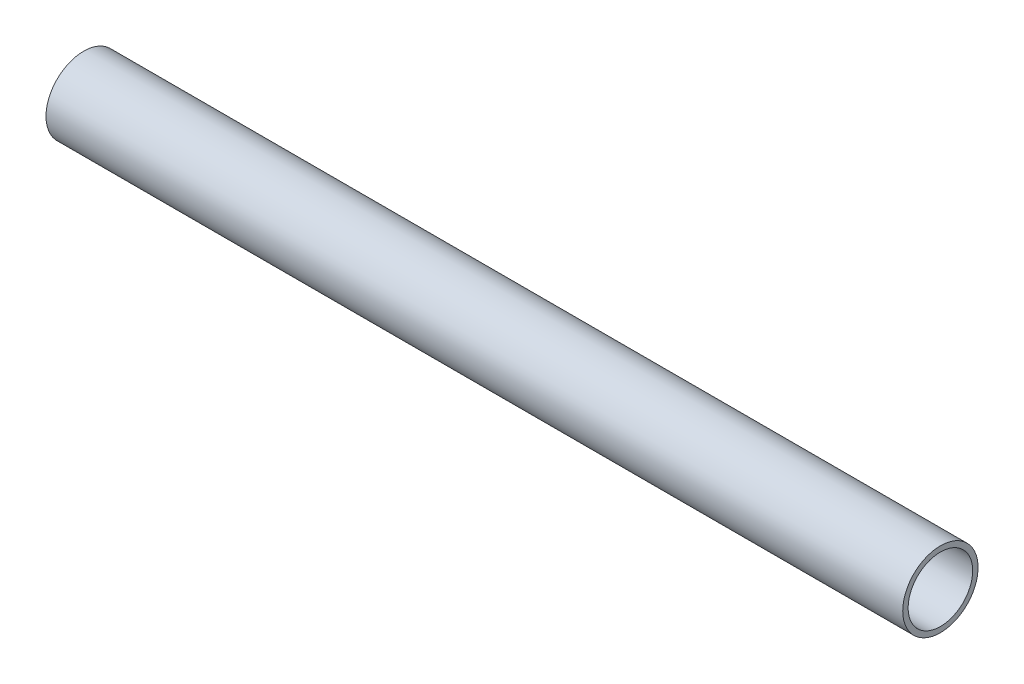
ISO-10303-21;
HEADER;
FILE_DESCRIPTION(('STEP AP214'),'2;1');
FILE_NAME('part.step','',(''),(''),'','','');
FILE_SCHEMA(('AUTOMOTIVE_DESIGN { 1 0 10303 214 1 1 1 1 }'));
ENDSEC;
DATA;
#1=APPLICATION_CONTEXT('core data for automotive mechanical design processes');
#2=APPLICATION_PROTOCOL_DEFINITION('international standard','automotive_design',2000,#1);
#3=PRODUCT_CONTEXT('',#1,'mechanical');
#4=PRODUCT('Part','Part','',(#3));
#5=PRODUCT_RELATED_PRODUCT_CATEGORY('part','',(#4));
#6=PRODUCT_DEFINITION_FORMATION('','',#4);
#7=PRODUCT_DEFINITION_CONTEXT('part definition',#1,'design');
#8=PRODUCT_DEFINITION('design','',#6,#7);
#9=PRODUCT_DEFINITION_SHAPE('','',#8);
#10=(LENGTH_UNIT() NAMED_UNIT(*) SI_UNIT(.MILLI.,.METRE.));
#11=(NAMED_UNIT(*) PLANE_ANGLE_UNIT() SI_UNIT($,.RADIAN.));
#12=(NAMED_UNIT(*) SI_UNIT($,.STERADIAN.) SOLID_ANGLE_UNIT());
#13=UNCERTAINTY_MEASURE_WITH_UNIT(LENGTH_MEASURE(1.E-05),#10,'distance_accuracy_value','');
#14=(GEOMETRIC_REPRESENTATION_CONTEXT(3) GLOBAL_UNCERTAINTY_ASSIGNED_CONTEXT((#13)) GLOBAL_UNIT_ASSIGNED_CONTEXT((#10,
#11,#12)) REPRESENTATION_CONTEXT('',''));
#15=CARTESIAN_POINT('',(0.,0.,0.));
#16=DIRECTION('',(0.,0.,1.));
#17=DIRECTION('',(1.,0.,0.));
#18=AXIS2_PLACEMENT_3D('',#15,#16,#17);
#19=CARTESIAN_POINT('',(79.6,0.,0.));
#20=DIRECTION('',(1.,0.,0.));
#21=DIRECTION('',(0.,0.,-1.));
#22=AXIS2_PLACEMENT_3D('',#19,#20,#21);
#23=PLANE('',#22);
#24=CARTESIAN_POINT('',(79.6,0.,0.));
#25=DIRECTION('',(1.,0.,0.));
#26=DIRECTION('',(0.,0.,-1.));
#27=AXIS2_PLACEMENT_3D('',#24,#25,#26);
#28=CIRCLE('',#27,7.);
#29=CARTESIAN_POINT('',(79.6,0.,7.));
#30=VERTEX_POINT('',#29);
#31=EDGE_CURVE('E10',#30,#30,#28,.T.);
#32=ORIENTED_EDGE('',*,*,#31,.T.);
#33=EDGE_LOOP('',(#32));
#34=FACE_BOUND('',#33,.T.);
#35=CARTESIAN_POINT('',(79.6,0.,0.));
#36=DIRECTION('',(1.,0.,0.));
#37=DIRECTION('',(0.,0.,-1.));
#38=AXIS2_PLACEMENT_3D('',#35,#36,#37);
#39=CIRCLE('',#38,6.);
#40=CARTESIAN_POINT('',(79.6,0.,6.));
#41=VERTEX_POINT('',#40);
#42=EDGE_CURVE('E54',#41,#41,#39,.T.);
#43=ORIENTED_EDGE('',*,*,#42,.F.);
#44=EDGE_LOOP('',(#43));
#45=FACE_BOUND('',#44,.T.);
#46=ADVANCED_FACE('F41',(#34,#45),#23,.T.);
#47=CARTESIAN_POINT('',(-79.6,0.,0.));
#48=DIRECTION('',(1.,0.,0.));
#49=DIRECTION('',(0.,0.,-1.));
#50=AXIS2_PLACEMENT_3D('',#47,#48,#49);
#51=PLANE('',#50);
#52=CARTESIAN_POINT('',(-79.6,0.,0.));
#53=DIRECTION('',(1.,0.,0.));
#54=DIRECTION('',(0.,0.,-1.));
#55=AXIS2_PLACEMENT_3D('',#52,#53,#54);
#56=CIRCLE('',#55,7.);
#57=CARTESIAN_POINT('',(-79.6,0.,7.));
#58=VERTEX_POINT('',#57);
#59=EDGE_CURVE('E45',#58,#58,#56,.T.);
#60=ORIENTED_EDGE('',*,*,#59,.F.);
#61=EDGE_LOOP('',(#60));
#62=FACE_BOUND('',#61,.T.);
#63=CARTESIAN_POINT('',(-79.6,0.,0.));
#64=DIRECTION('',(1.,0.,0.));
#65=DIRECTION('',(0.,0.,-1.));
#66=AXIS2_PLACEMENT_3D('',#63,#64,#65);
#67=CIRCLE('',#66,6.);
#68=CARTESIAN_POINT('',(-79.6,0.,6.));
#69=VERTEX_POINT('',#68);
#70=EDGE_CURVE('E56',#69,#69,#67,.T.);
#71=ORIENTED_EDGE('',*,*,#70,.T.);
#72=EDGE_LOOP('',(#71));
#73=FACE_BOUND('',#72,.T.);
#74=ADVANCED_FACE('F68',(#62,#73),#51,.F.);
#75=CARTESIAN_POINT('',(79.6,0.,0.));
#76=DIRECTION('',(-1.,0.,0.));
#77=DIRECTION('',(0.,0.,1.));
#78=AXIS2_PLACEMENT_3D('',#75,#76,#77);
#79=CYLINDRICAL_SURFACE('',#78,7.);
#80=CARTESIAN_POINT('',(79.6,0.,7.));
#81=CARTESIAN_POINT('',(77.9416666666666,0.,7.));
#82=CARTESIAN_POINT('',(76.2833333333333,0.,7.));
#83=CARTESIAN_POINT('',(72.9666666666667,0.,7.));
#84=CARTESIAN_POINT('',(71.3083333333333,0.,7.));
#85=CARTESIAN_POINT('',(67.9916666666667,0.,7.));
#86=CARTESIAN_POINT('',(66.3333333333333,0.,7.));
#87=CARTESIAN_POINT('',(63.0166666666667,0.,7.));
#88=CARTESIAN_POINT('',(61.3583333333333,0.,7.));
#89=CARTESIAN_POINT('',(58.0416666666667,0.,7.));
#90=CARTESIAN_POINT('',(56.3833333333333,0.,7.));
#91=CARTESIAN_POINT('',(53.0666666666666,0.,7.));
#92=CARTESIAN_POINT('',(51.4083333333333,0.,7.));
#93=CARTESIAN_POINT('',(48.0916666666667,0.,7.));
#94=CARTESIAN_POINT('',(46.4333333333333,0.,7.));
#95=CARTESIAN_POINT('',(43.1166666666667,0.,7.));
#96=CARTESIAN_POINT('',(41.4583333333333,0.,7.));
#97=CARTESIAN_POINT('',(38.1416666666667,0.,7.));
#98=CARTESIAN_POINT('',(36.4833333333333,0.,7.));
#99=CARTESIAN_POINT('',(33.1666666666667,0.,7.));
#100=CARTESIAN_POINT('',(31.5083333333333,0.,7.));
#101=CARTESIAN_POINT('',(28.1916666666667,0.,7.));
#102=CARTESIAN_POINT('',(26.5333333333333,0.,7.));
#103=CARTESIAN_POINT('',(23.2166666666667,0.,7.));
#104=CARTESIAN_POINT('',(21.5583333333333,0.,7.));
#105=CARTESIAN_POINT('',(18.2416666666667,0.,7.));
#106=CARTESIAN_POINT('',(16.5833333333333,0.,7.));
#107=CARTESIAN_POINT('',(13.2666666666666,0.,7.));
#108=CARTESIAN_POINT('',(11.6083333333333,0.,7.));
#109=CARTESIAN_POINT('',(8.29166666666666,0.,7.));
#110=CARTESIAN_POINT('',(6.63333333333332,0.,7.));
#111=CARTESIAN_POINT('',(3.31666666666666,0.,7.));
#112=CARTESIAN_POINT('',(1.65833333333332,0.,7.));
#113=CARTESIAN_POINT('',(-1.65833333333335,0.,7.));
#114=CARTESIAN_POINT('',(-3.31666666666668,0.,7.));
#115=CARTESIAN_POINT('',(-6.63333333333335,0.,7.));
#116=CARTESIAN_POINT('',(-8.29166666666668,0.,7.));
#117=CARTESIAN_POINT('',(-11.6083333333333,0.,7.));
#118=CARTESIAN_POINT('',(-13.2666666666667,0.,7.));
#119=CARTESIAN_POINT('',(-16.5833333333333,0.,7.));
#120=CARTESIAN_POINT('',(-18.2416666666667,0.,7.));
#121=CARTESIAN_POINT('',(-21.5583333333333,0.,7.));
#122=CARTESIAN_POINT('',(-23.2166666666667,0.,7.));
#123=CARTESIAN_POINT('',(-26.5333333333334,0.,7.));
#124=CARTESIAN_POINT('',(-28.1916666666667,0.,7.));
#125=CARTESIAN_POINT('',(-31.5083333333333,0.,7.));
#126=CARTESIAN_POINT('',(-33.1666666666667,0.,7.));
#127=CARTESIAN_POINT('',(-36.4833333333333,0.,7.));
#128=CARTESIAN_POINT('',(-38.1416666666667,0.,7.));
#129=CARTESIAN_POINT('',(-41.4583333333334,0.,7.));
#130=CARTESIAN_POINT('',(-43.1166666666667,0.,7.));
#131=CARTESIAN_POINT('',(-46.4333333333333,0.,7.));
#132=CARTESIAN_POINT('',(-48.0916666666667,0.,7.));
#133=CARTESIAN_POINT('',(-51.4083333333333,0.,7.));
#134=CARTESIAN_POINT('',(-53.0666666666667,0.,7.));
#135=CARTESIAN_POINT('',(-56.3833333333333,0.,7.));
#136=CARTESIAN_POINT('',(-58.0416666666667,0.,7.));
#137=CARTESIAN_POINT('',(-61.3583333333333,0.,7.));
#138=CARTESIAN_POINT('',(-63.0166666666667,0.,7.));
#139=CARTESIAN_POINT('',(-66.3333333333333,0.,7.));
#140=CARTESIAN_POINT('',(-67.9916666666666,0.,7.));
#141=CARTESIAN_POINT('',(-71.3083333333333,0.,7.));
#142=CARTESIAN_POINT('',(-72.9666666666667,0.,7.));
#143=CARTESIAN_POINT('',(-76.2833333333333,0.,7.));
#144=CARTESIAN_POINT('',(-77.9416666666667,0.,7.));
#145=CARTESIAN_POINT('',(-79.6,0.,7.));
#146=B_SPLINE_CURVE_WITH_KNOTS('',3,(#80,#81,#82,#83,#84,#85,#86,#87,#88,#89,#90,#91,#92,#93,
#94,#95,#96,#97,#98,#99,#100,#101,#102,#103,#104,#105,#106,#107,#108,#109,#110,#111,#112,#113,
#114,#115,#116,#117,#118,#119,#120,#121,#122,#123,#124,#125,#126,#127,#128,#129,#130,#131,#132,
#133,#134,#135,#136,#137,#138,#139,#140,#141,#142,#143,#144,#145),.UNSPECIFIED.,.F.,.F.,(4,2,2,
2,2,2,2,2,2,2,2,2,2,2,2,2,2,2,2,2,2,2,2,2,2,2,2,2,2,2,2,2,4),(0.,4.97499999999999,
9.94999999999999,14.925,19.9,24.875,29.85,34.825,39.8,44.775,49.75,54.725,59.7,64.675,69.65,
74.625,79.6,84.575,89.55,94.525,99.5,104.475,109.45,114.425,119.4,124.375,129.35,134.325,139.3,
144.275,149.25,154.225,159.2),.UNSPECIFIED.);
#147=EDGE_CURVE('BSEAM43',#30,#58,#146,.T.);
#148=ORIENTED_EDGE('',*,*,#31,.F.);
#149=ORIENTED_EDGE('',*,*,#59,.T.);
#150=ORIENTED_EDGE('',*,*,#147,.T.);
#151=ORIENTED_EDGE('',*,*,#147,.F.);
#152=EDGE_LOOP('',(#148,#150,#149,#151));
#153=FACE_BOUND('',#152,.T.);
#154=ADVANCED_FACE('F43',(#153),#79,.T.);
#155=CARTESIAN_POINT('',(79.6,0.,0.));
#156=DIRECTION('',(-1.,0.,0.));
#157=DIRECTION('',(0.,0.,1.));
#158=AXIS2_PLACEMENT_3D('',#155,#156,#157);
#159=CYLINDRICAL_SURFACE('',#158,6.);
#160=CARTESIAN_POINT('',(79.6,0.,6.));
#161=CARTESIAN_POINT('',(77.9416666666666,0.,6.));
#162=CARTESIAN_POINT('',(76.2833333333333,0.,6.));
#163=CARTESIAN_POINT('',(72.9666666666667,0.,6.));
#164=CARTESIAN_POINT('',(71.3083333333333,0.,6.));
#165=CARTESIAN_POINT('',(67.9916666666667,0.,6.));
#166=CARTESIAN_POINT('',(66.3333333333333,0.,6.));
#167=CARTESIAN_POINT('',(63.0166666666667,0.,6.));
#168=CARTESIAN_POINT('',(61.3583333333333,0.,6.));
#169=CARTESIAN_POINT('',(58.0416666666667,0.,6.));
#170=CARTESIAN_POINT('',(56.3833333333333,0.,6.));
#171=CARTESIAN_POINT('',(53.0666666666666,0.,6.));
#172=CARTESIAN_POINT('',(51.4083333333333,0.,6.));
#173=CARTESIAN_POINT('',(48.0916666666667,0.,6.));
#174=CARTESIAN_POINT('',(46.4333333333333,0.,6.));
#175=CARTESIAN_POINT('',(43.1166666666667,0.,6.));
#176=CARTESIAN_POINT('',(41.4583333333333,0.,6.));
#177=CARTESIAN_POINT('',(38.1416666666667,0.,6.));
#178=CARTESIAN_POINT('',(36.4833333333333,0.,6.));
#179=CARTESIAN_POINT('',(33.1666666666667,0.,6.));
#180=CARTESIAN_POINT('',(31.5083333333333,0.,6.));
#181=CARTESIAN_POINT('',(28.1916666666667,0.,6.));
#182=CARTESIAN_POINT('',(26.5333333333333,0.,6.));
#183=CARTESIAN_POINT('',(23.2166666666667,0.,6.));
#184=CARTESIAN_POINT('',(21.5583333333333,0.,6.));
#185=CARTESIAN_POINT('',(18.2416666666667,0.,6.));
#186=CARTESIAN_POINT('',(16.5833333333333,0.,6.));
#187=CARTESIAN_POINT('',(13.2666666666666,0.,6.));
#188=CARTESIAN_POINT('',(11.6083333333333,0.,6.));
#189=CARTESIAN_POINT('',(8.29166666666666,0.,6.));
#190=CARTESIAN_POINT('',(6.63333333333332,0.,6.));
#191=CARTESIAN_POINT('',(3.31666666666666,0.,6.));
#192=CARTESIAN_POINT('',(1.65833333333332,0.,6.));
#193=CARTESIAN_POINT('',(-1.65833333333335,0.,6.));
#194=CARTESIAN_POINT('',(-3.31666666666668,0.,6.));
#195=CARTESIAN_POINT('',(-6.63333333333335,0.,6.));
#196=CARTESIAN_POINT('',(-8.29166666666668,0.,6.));
#197=CARTESIAN_POINT('',(-11.6083333333333,0.,6.));
#198=CARTESIAN_POINT('',(-13.2666666666667,0.,6.));
#199=CARTESIAN_POINT('',(-16.5833333333333,0.,6.));
#200=CARTESIAN_POINT('',(-18.2416666666667,0.,6.));
#201=CARTESIAN_POINT('',(-21.5583333333333,0.,6.));
#202=CARTESIAN_POINT('',(-23.2166666666667,0.,6.));
#203=CARTESIAN_POINT('',(-26.5333333333334,0.,6.));
#204=CARTESIAN_POINT('',(-28.1916666666667,0.,6.));
#205=CARTESIAN_POINT('',(-31.5083333333333,0.,6.));
#206=CARTESIAN_POINT('',(-33.1666666666667,0.,6.));
#207=CARTESIAN_POINT('',(-36.4833333333333,0.,6.));
#208=CARTESIAN_POINT('',(-38.1416666666667,0.,6.));
#209=CARTESIAN_POINT('',(-41.4583333333334,0.,6.));
#210=CARTESIAN_POINT('',(-43.1166666666667,0.,6.));
#211=CARTESIAN_POINT('',(-46.4333333333333,0.,6.));
#212=CARTESIAN_POINT('',(-48.0916666666667,0.,6.));
#213=CARTESIAN_POINT('',(-51.4083333333333,0.,6.));
#214=CARTESIAN_POINT('',(-53.0666666666667,0.,6.));
#215=CARTESIAN_POINT('',(-56.3833333333333,0.,6.));
#216=CARTESIAN_POINT('',(-58.0416666666667,0.,6.));
#217=CARTESIAN_POINT('',(-61.3583333333333,0.,6.));
#218=CARTESIAN_POINT('',(-63.0166666666667,0.,6.));
#219=CARTESIAN_POINT('',(-66.3333333333333,0.,6.));
#220=CARTESIAN_POINT('',(-67.9916666666666,0.,6.));
#221=CARTESIAN_POINT('',(-71.3083333333333,0.,6.));
#222=CARTESIAN_POINT('',(-72.9666666666667,0.,6.));
#223=CARTESIAN_POINT('',(-76.2833333333333,0.,6.));
#224=CARTESIAN_POINT('',(-77.9416666666667,0.,6.));
#225=CARTESIAN_POINT('',(-79.6,0.,6.));
#226=B_SPLINE_CURVE_WITH_KNOTS('',3,(#160,#161,#162,#163,#164,#165,#166,#167,#168,#169,#170,
#171,#172,#173,#174,#175,#176,#177,#178,#179,#180,#181,#182,#183,#184,#185,#186,#187,#188,#189,
#190,#191,#192,#193,#194,#195,#196,#197,#198,#199,#200,#201,#202,#203,#204,#205,#206,#207,#208,
#209,#210,#211,#212,#213,#214,#215,#216,#217,#218,#219,#220,#221,#222,#223,#224,#225),
.UNSPECIFIED.,.F.,.F.,(4,2,2,2,2,2,2,2,2,2,2,2,2,2,2,2,2,2,2,2,2,2,2,2,2,2,2,2,2,2,2,2,4),(0.,
4.97499999999999,9.94999999999999,14.925,19.9,24.875,29.85,34.825,39.8,44.775,49.75,54.725,59.7,
64.675,69.65,74.625,79.6,84.575,89.55,94.525,99.5,104.475,109.45,114.425,119.4,124.375,129.35,
134.325,139.3,144.275,149.25,154.225,159.2),.UNSPECIFIED.);
#227=EDGE_CURVE('BSEAM64',#41,#69,#226,.T.);
#228=ORIENTED_EDGE('',*,*,#42,.T.);
#229=ORIENTED_EDGE('',*,*,#70,.F.);
#230=ORIENTED_EDGE('',*,*,#227,.T.);
#231=ORIENTED_EDGE('',*,*,#227,.F.);
#232=EDGE_LOOP('',(#228,#230,#229,#231));
#233=FACE_BOUND('',#232,.T.);
#234=ADVANCED_FACE('F64',(#233),#159,.F.);
#235=CLOSED_SHELL('',(#46,#74,#154,#234));
#236=MANIFOLD_SOLID_BREP('B2',#235);
#237=ADVANCED_BREP_SHAPE_REPRESENTATION('',(#18,#236),#14);
#238=SHAPE_DEFINITION_REPRESENTATION(#9,#237);
ENDSEC;
END-ISO-10303-21;
